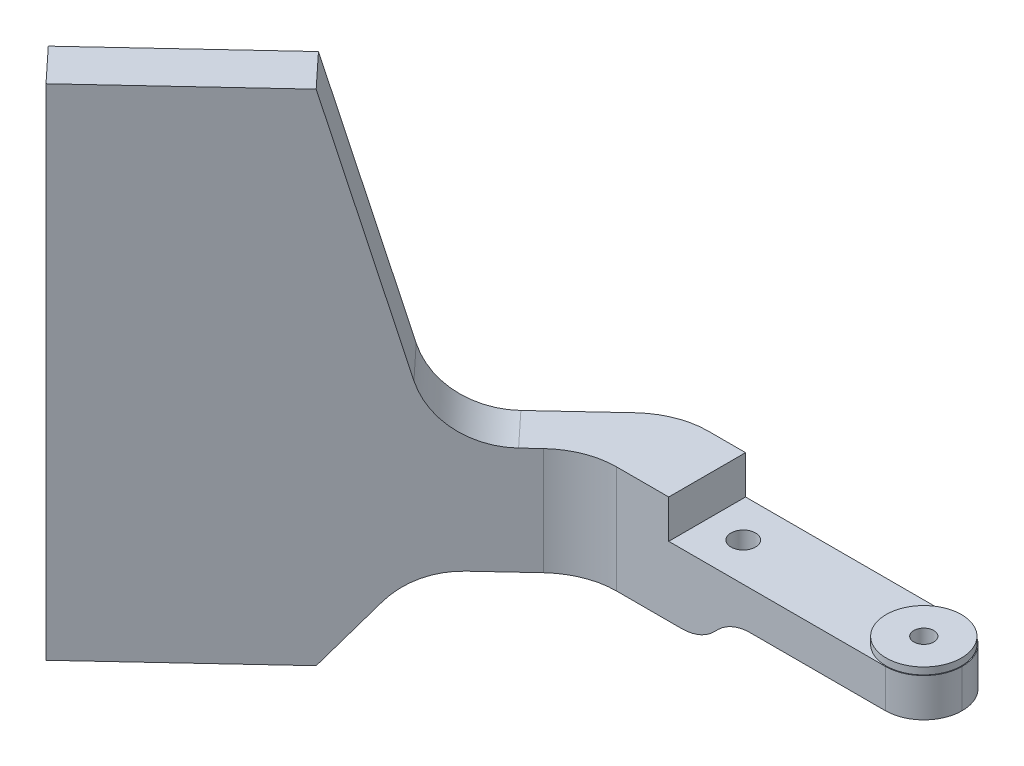
ISO-10303-21;
HEADER;
FILE_DESCRIPTION(('STEP AP214'),'2;1');
FILE_NAME('part.step','',(''),(''),'','','');
FILE_SCHEMA(('AUTOMOTIVE_DESIGN { 1 0 10303 214 1 1 1 1 }'));
ENDSEC;
DATA;
#1=APPLICATION_CONTEXT('core data for automotive mechanical design processes');
#2=APPLICATION_PROTOCOL_DEFINITION('international standard','automotive_design',2000,#1);
#3=PRODUCT_CONTEXT('',#1,'mechanical');
#4=PRODUCT('Part','Part','',(#3));
#5=PRODUCT_RELATED_PRODUCT_CATEGORY('part','',(#4));
#6=PRODUCT_DEFINITION_FORMATION('','',#4);
#7=PRODUCT_DEFINITION_CONTEXT('part definition',#1,'design');
#8=PRODUCT_DEFINITION('design','',#6,#7);
#9=PRODUCT_DEFINITION_SHAPE('','',#8);
#10=(LENGTH_UNIT() NAMED_UNIT(*) SI_UNIT(.MILLI.,.METRE.));
#11=(NAMED_UNIT(*) PLANE_ANGLE_UNIT() SI_UNIT($,.RADIAN.));
#12=(NAMED_UNIT(*) SI_UNIT($,.STERADIAN.) SOLID_ANGLE_UNIT());
#13=UNCERTAINTY_MEASURE_WITH_UNIT(LENGTH_MEASURE(1.E-05),#10,'distance_accuracy_value','');
#14=(GEOMETRIC_REPRESENTATION_CONTEXT(3) GLOBAL_UNCERTAINTY_ASSIGNED_CONTEXT((#13)) GLOBAL_UNIT_ASSIGNED_CONTEXT((#10,
#11,#12)) REPRESENTATION_CONTEXT('',''));
#15=CARTESIAN_POINT('',(0.,0.,0.));
#16=DIRECTION('',(0.,0.,1.));
#17=DIRECTION('',(1.,0.,0.));
#18=AXIS2_PLACEMENT_3D('',#15,#16,#17);
#19=CARTESIAN_POINT('',(0.,0.,0.));
#20=DIRECTION('',(0.,1.,0.));
#21=DIRECTION('',(0.,0.,1.));
#22=AXIS2_PLACEMENT_3D('',#19,#20,#21);
#23=PLANE('',#22);
#24=CARTESIAN_POINT('',(37.,0.,-4.99999999999999));
#25=DIRECTION('',(0.,1.,0.));
#26=DIRECTION('',(0.,0.,1.));
#27=AXIS2_PLACEMENT_3D('',#24,#25,#26);
#28=CIRCLE('',#27,1.29999999999999);
#29=CARTESIAN_POINT('',(37.,0.,-3.69999999999999));
#30=VERTEX_POINT('',#29);
#31=EDGE_CURVE('E344',#30,#30,#28,.T.);
#32=ORIENTED_EDGE('',*,*,#31,.T.);
#33=EDGE_LOOP('',(#32));
#34=FACE_BOUND('',#33,.T.);
#35=DIRECTION('',(-1.,0.,0.));
#36=VECTOR('',#35,1.);
#37=CARTESIAN_POINT('',(0.,0.,0.));
#38=LINE('',#37,#36);
#39=CARTESIAN_POINT('',(37.,0.,0.));
#40=VERTEX_POINT('',#39);
#41=CARTESIAN_POINT('',(19.4358017997251,0.,0.));
#42=VERTEX_POINT('',#41);
#43=EDGE_CURVE('E331',#40,#42,#38,.T.);
#44=ORIENTED_EDGE('',*,*,#43,.T.);
#45=DIRECTION('',(0.,0.,1.));
#46=VECTOR('',#45,1.);
#47=CARTESIAN_POINT('',(19.4358017997251,0.,0.));
#48=LINE('',#47,#46);
#49=CARTESIAN_POINT('',(19.4358017997251,0.,-10.));
#50=VERTEX_POINT('',#49);
#51=EDGE_CURVE('E209',#42,#50,#48,.F.);
#52=ORIENTED_EDGE('',*,*,#51,.T.);
#53=DIRECTION('',(1.,0.,0.));
#54=VECTOR('',#53,1.);
#55=CARTESIAN_POINT('',(0.,0.,-10.));
#56=LINE('',#55,#54);
#57=CARTESIAN_POINT('',(37.,0.,-10.));
#58=VERTEX_POINT('',#57);
#59=EDGE_CURVE('E338',#50,#58,#56,.T.);
#60=ORIENTED_EDGE('',*,*,#59,.T.);
#61=CARTESIAN_POINT('',(37.,0.,-5.));
#62=DIRECTION('',(0.,1.,0.));
#63=DIRECTION('',(0.,0.,1.));
#64=AXIS2_PLACEMENT_3D('',#61,#62,#63);
#65=CIRCLE('',#64,5.);
#66=CARTESIAN_POINT('',(42.,0.,-5.));
#67=VERTEX_POINT('',#66);
#68=EDGE_CURVE('E354',#58,#67,#65,.F.);
#69=ORIENTED_EDGE('',*,*,#68,.T.);
#70=CARTESIAN_POINT('',(37.,0.,-5.00000000000001));
#71=DIRECTION('',(0.,1.,0.));
#72=DIRECTION('',(0.,0.,1.));
#73=AXIS2_PLACEMENT_3D('',#70,#71,#72);
#74=CIRCLE('',#73,5.);
#75=EDGE_CURVE('E337',#67,#40,#74,.F.);
#76=ORIENTED_EDGE('',*,*,#75,.T.);
#77=EDGE_LOOP('',(#44,#52,#60,#69,#76));
#78=FACE_BOUND('',#77,.T.);
#79=ADVANCED_FACE('F34',(#34,#78),#23,.F.);
#80=CARTESIAN_POINT('',(0.,5.,0.));
#81=DIRECTION('',(0.,1.,0.));
#82=DIRECTION('',(0.,0.,1.));
#83=AXIS2_PLACEMENT_3D('',#80,#81,#82);
#84=PLANE('',#83);
#85=CARTESIAN_POINT('',(13.500000000001,5.,-5.00000000000016));
#86=DIRECTION('',(0.,1.,0.));
#87=DIRECTION('',(0.,0.,1.));
#88=AXIS2_PLACEMENT_3D('',#85,#86,#87);
#89=CIRCLE('',#88,1.6);
#90=CARTESIAN_POINT('',(13.500000000001,5.,-3.40000000000016));
#91=VERTEX_POINT('',#90);
#92=EDGE_CURVE('E202',#91,#91,#89,.T.);
#93=ORIENTED_EDGE('',*,*,#92,.F.);
#94=EDGE_LOOP('',(#93));
#95=FACE_BOUND('',#94,.T.);
#96=DIRECTION('',(0.,0.,-1.));
#97=VECTOR('',#96,1.);
#98=CARTESIAN_POINT('',(8.79767511383781,5.,-10.));
#99=LINE('',#98,#97);
#100=CARTESIAN_POINT('',(8.79767511383774,5.,0.));
#101=VERTEX_POINT('',#100);
#102=CARTESIAN_POINT('',(8.79767511383781,5.,-10.));
#103=VERTEX_POINT('',#102);
#104=EDGE_CURVE('E438',#101,#103,#99,.T.);
#105=ORIENTED_EDGE('',*,*,#104,.F.);
#106=DIRECTION('',(-1.,0.,0.));
#107=VECTOR('',#106,1.);
#108=CARTESIAN_POINT('',(0.,5.,0.));
#109=LINE('',#108,#107);
#110=CARTESIAN_POINT('',(37.,5.,0.));
#111=VERTEX_POINT('',#110);
#112=EDGE_CURVE('E341',#111,#101,#109,.T.);
#113=ORIENTED_EDGE('',*,*,#112,.F.);
#114=CARTESIAN_POINT('',(37.,5.,-5.00000000000001));
#115=DIRECTION('',(0.,1.,0.));
#116=DIRECTION('',(0.,0.,1.));
#117=AXIS2_PLACEMENT_3D('',#114,#115,#116);
#118=CIRCLE('',#117,5.);
#119=CARTESIAN_POINT('',(42.,5.,-5.));
#120=VERTEX_POINT('',#119);
#121=EDGE_CURVE('E362',#111,#120,#118,.T.);
#122=ORIENTED_EDGE('',*,*,#121,.T.);
#123=CARTESIAN_POINT('',(37.,5.,-5.));
#124=DIRECTION('',(0.,1.,0.));
#125=DIRECTION('',(0.,0.,1.));
#126=AXIS2_PLACEMENT_3D('',#123,#124,#125);
#127=CIRCLE('',#126,5.);
#128=CARTESIAN_POINT('',(37.,5.,-10.));
#129=VERTEX_POINT('',#128);
#130=EDGE_CURVE('E359',#120,#129,#127,.T.);
#131=ORIENTED_EDGE('',*,*,#130,.T.);
#132=DIRECTION('',(1.,0.,0.));
#133=VECTOR('',#132,1.);
#134=CARTESIAN_POINT('',(0.,5.,-10.));
#135=LINE('',#134,#133);
#136=EDGE_CURVE('E347',#103,#129,#135,.T.);
#137=ORIENTED_EDGE('',*,*,#136,.F.);
#138=EDGE_LOOP('',(#105,#113,#122,#131,#137));
#139=FACE_BOUND('',#138,.T.);
#140=CARTESIAN_POINT('',(37.,5.,-4.99999999999999));
#141=DIRECTION('',(0.,1.,0.));
#142=DIRECTION('',(0.,0.,1.));
#143=AXIS2_PLACEMENT_3D('',#140,#141,#142);
#144=CIRCLE('',#143,4.9);
#145=CARTESIAN_POINT('',(37.,5.,-0.0999999999999873));
#146=VERTEX_POINT('',#145);
#147=EDGE_CURVE('E366',#146,#146,#144,.T.);
#148=ORIENTED_EDGE('',*,*,#147,.F.);
#149=EDGE_LOOP('',(#148));
#150=FACE_BOUND('',#149,.T.);
#151=ADVANCED_FACE('F265',(#95,#139,#150),#84,.T.);
#152=CARTESIAN_POINT('',(-11.0535847060781,5.,8.51159926090981));
#153=DIRECTION('',(0.705053553573808,0.265760497297975,-0.657473075242537));
#154=DIRECTION('',(-0.681998360062495,0.,-0.731353701619174));
#155=AXIS2_PLACEMENT_3D('',#152,#153,#154);
#156=PLANE('',#155);
#157=DIRECTION('',(0.194364923443027,-0.964039085346612,-0.181248223326612));
#158=VECTOR('',#157,1.);
#159=CARTESIAN_POINT('',(-11.0535847060781,5.,8.51159926090981));
#160=LINE('',#159,#158);
#161=CARTESIAN_POINT('',(-20.1262682599731,50.,16.9720135466699));
#162=VERTEX_POINT('',#161);
#163=CARTESIAN_POINT('',(-13.5419990255742,17.3423950270202,10.8320831544008));
#164=VERTEX_POINT('',#163);
#165=EDGE_CURVE('E395',#162,#164,#160,.T.);
#166=ORIENTED_EDGE('',*,*,#165,.T.);
#167=DIRECTION('',(-0.681998360062495,0.,-0.731353701619174));
#168=VECTOR('',#167,1.);
#169=CARTESIAN_POINT('',(-13.5419990255742,17.3423950270202,10.8320831544008));
#170=LINE('',#169,#168);
#171=CARTESIAN_POINT('',(-17.6339891859491,17.3423950270202,6.44396094468579));
#172=VERTEX_POINT('',#171);
#173=EDGE_CURVE('E477',#164,#172,#170,.T.);
#174=ORIENTED_EDGE('',*,*,#173,.T.);
#175=DIRECTION('',(0.194364923443027,-0.964039085346612,-0.181248223326612));
#176=VECTOR('',#175,1.);
#177=CARTESIAN_POINT('',(-15.1455748664531,5.,4.12347705119476));
#178=LINE('',#177,#176);
#179=CARTESIAN_POINT('',(-24.2182584203481,50.,12.5838913369548));
#180=VERTEX_POINT('',#179);
#181=EDGE_CURVE('E394',#180,#172,#178,.T.);
#182=ORIENTED_EDGE('',*,*,#181,.F.);
#183=DIRECTION('',(-0.681998360062495,0.,-0.731353701619174));
#184=VECTOR('',#183,1.);
#185=CARTESIAN_POINT('',(-20.1262682599731,50.,16.9720135466699));
#186=LINE('',#185,#184);
#187=EDGE_CURVE('E370',#162,#180,#186,.T.);
#188=ORIENTED_EDGE('',*,*,#187,.F.);
#189=EDGE_LOOP('',(#166,#174,#182,#188));
#190=FACE_BOUND('',#189,.T.);
#191=ADVANCED_FACE('F261',(#190),#156,.T.);
#192=CARTESIAN_POINT('',(-11.0535847060781,0.,8.51159926090981));
#193=DIRECTION('',(0.563586903258906,-0.637309612531581,-0.525553289638531));
#194=DIRECTION('',(0.74910562425053,0.662450574545923,0.));
#195=AXIS2_PLACEMENT_3D('',#192,#193,#194);
#196=PLANE('',#195);
#197=DIRECTION('',(-0.466098744202454,-0.770607849541416,0.434644110598602));
#198=VECTOR('',#197,1.);
#199=CARTESIAN_POINT('',(-15.1455748664531,0.,4.12347705119476));
#200=LINE('',#199,#198);
#201=CARTESIAN_POINT('',(-19.7586738898521,-7.62690387468418,8.42526148436122));
#202=VERTEX_POINT('',#201);
#203=CARTESIAN_POINT('',(-24.2182584203481,-15.,12.5838913369548));
#204=VERTEX_POINT('',#203);
#205=EDGE_CURVE('E398',#202,#204,#200,.T.);
#206=ORIENTED_EDGE('',*,*,#205,.F.);
#207=DIRECTION('',(0.681998360062495,0.,0.731353701619174));
#208=VECTOR('',#207,1.);
#209=CARTESIAN_POINT('',(-15.6666837294771,-7.62690387468418,12.8133836940763));
#210=LINE('',#209,#208);
#211=CARTESIAN_POINT('',(-15.6666837294771,-7.62690387468418,12.8133836940763));
#212=VERTEX_POINT('',#211);
#213=EDGE_CURVE('E470',#202,#212,#210,.T.);
#214=ORIENTED_EDGE('',*,*,#213,.T.);
#215=DIRECTION('',(-0.466098744202454,-0.770607849541416,0.434644110598602));
#216=VECTOR('',#215,1.);
#217=CARTESIAN_POINT('',(-11.0535847060781,0.,8.51159926090981));
#218=LINE('',#217,#216);
#219=CARTESIAN_POINT('',(-20.1262682599731,-15.,16.9720135466699));
#220=VERTEX_POINT('',#219);
#221=EDGE_CURVE('E401',#212,#220,#218,.T.);
#222=ORIENTED_EDGE('',*,*,#221,.T.);
#223=DIRECTION('',(0.681998360062494,0.,0.731353701619174));
#224=VECTOR('',#223,1.);
#225=CARTESIAN_POINT('',(-20.1262682599731,-15.,16.9720135466699));
#226=LINE('',#225,#224);
#227=EDGE_CURVE('E407',#204,#220,#226,.T.);
#228=ORIENTED_EDGE('',*,*,#227,.F.);
#229=EDGE_LOOP('',(#206,#214,#222,#228));
#230=FACE_BOUND('',#229,.T.);
#231=ADVANCED_FACE('F264',(#230),#196,.T.);
#232=CARTESIAN_POINT('',(0.,5.,0.));
#233=DIRECTION('',(0.,0.,1.));
#234=DIRECTION('',(1.,0.,0.));
#235=AXIS2_PLACEMENT_3D('',#232,#233,#234);
#236=PLANE('',#235);
#237=DIRECTION('',(1.,0.,0.));
#238=VECTOR('',#237,1.);
#239=CARTESIAN_POINT('',(8.79767511383774,10.,0.));
#240=LINE('',#239,#238);
#241=CARTESIAN_POINT('',(2.01309276974024,10.,0.));
#242=VERTEX_POINT('',#241);
#243=CARTESIAN_POINT('',(8.79767511383774,10.,0.));
#244=VERTEX_POINT('',#243);
#245=EDGE_CURVE('E447',#242,#244,#240,.T.);
#246=ORIENTED_EDGE('',*,*,#245,.F.);
#247=DIRECTION('',(0.,-1.,0.));
#248=VECTOR('',#247,1.);
#249=CARTESIAN_POINT('',(2.01309276974024,5.,0.));
#250=LINE('',#249,#248);
#251=CARTESIAN_POINT('',(2.01309276974024,-4.,0.));
#252=VERTEX_POINT('',#251);
#253=EDGE_CURVE('E191',#242,#252,#250,.T.);
#254=ORIENTED_EDGE('',*,*,#253,.T.);
#255=DIRECTION('',(1.,0.,0.));
#256=VECTOR('',#255,1.);
#257=CARTESIAN_POINT('',(0.,-4.,0.));
#258=LINE('',#257,#256);
#259=CARTESIAN_POINT('',(10.465239051248,-4.,0.));
#260=VERTEX_POINT('',#259);
#261=EDGE_CURVE('E201',#252,#260,#258,.T.);
#262=ORIENTED_EDGE('',*,*,#261,.T.);
#263=CARTESIAN_POINT('',(10.465239051248,2.,0.));
#264=DIRECTION('',(0.,0.,1.));
#265=DIRECTION('',(1.,0.,0.));
#266=AXIS2_PLACEMENT_3D('',#263,#264,#265);
#267=CIRCLE('',#266,6.);
#268=CARTESIAN_POINT('',(14.7078797383672,-2.2426406871193,0.));
#269=VERTEX_POINT('',#268);
#270=EDGE_CURVE('E221',#260,#269,#267,.T.);
#271=ORIENTED_EDGE('',*,*,#270,.T.);
#272=DIRECTION('',(-0.707106781186551,-0.707106781186544,0.));
#273=VECTOR('',#272,1.);
#274=CARTESIAN_POINT('',(10.9752602127432,-5.97526021274331,0.));
#275=LINE('',#274,#273);
#276=CARTESIAN_POINT('',(15.1931611126059,-1.75735931288069,0.));
#277=VERTEX_POINT('',#276);
#278=EDGE_CURVE('E333',#269,#277,#275,.F.);
#279=ORIENTED_EDGE('',*,*,#278,.T.);
#280=CARTESIAN_POINT('',(19.4358017997251,-6.,0.));
#281=DIRECTION('',(0.,0.,1.));
#282=DIRECTION('',(1.,0.,0.));
#283=AXIS2_PLACEMENT_3D('',#280,#281,#282);
#284=CIRCLE('',#283,6.);
#285=EDGE_CURVE('E192',#277,#42,#284,.F.);
#286=ORIENTED_EDGE('',*,*,#285,.T.);
#287=ORIENTED_EDGE('',*,*,#43,.F.);
#288=DIRECTION('',(0.,-1.,0.));
#289=VECTOR('',#288,1.);
#290=CARTESIAN_POINT('',(37.,5.,0.));
#291=LINE('',#290,#289);
#292=EDGE_CURVE('E357',#40,#111,#291,.F.);
#293=ORIENTED_EDGE('',*,*,#292,.T.);
#294=ORIENTED_EDGE('',*,*,#112,.T.);
#295=DIRECTION('',(0.,-1.,0.));
#296=VECTOR('',#295,1.);
#297=CARTESIAN_POINT('',(8.79767511383774,10.,0.));
#298=LINE('',#297,#296);
#299=EDGE_CURVE('E377',#244,#101,#298,.T.);
#300=ORIENTED_EDGE('',*,*,#299,.F.);
#301=EDGE_LOOP('',(#246,#254,#262,#271,#279,#286,#287,#293,#294,#300));
#302=FACE_BOUND('',#301,.T.);
#303=ADVANCED_FACE('F269',(#302),#236,.T.);
#304=CARTESIAN_POINT('',(0.,5.,-10.));
#305=DIRECTION('',(0.,0.,-1.));
#306=DIRECTION('',(-1.,0.,0.));
#307=AXIS2_PLACEMENT_3D('',#304,#305,#306);
#308=PLANE('',#307);
#309=DIRECTION('',(1.,0.,0.));
#310=VECTOR('',#309,1.);
#311=CARTESIAN_POINT('',(8.79767511383777,-4.,-10.));
#312=LINE('',#311,#310);
#313=CARTESIAN_POINT('',(3.9391047561494,-4.,-10.));
#314=VERTEX_POINT('',#313);
#315=CARTESIAN_POINT('',(10.465239051248,-4.,-10.));
#316=VERTEX_POINT('',#315);
#317=EDGE_CURVE('E375',#314,#316,#312,.T.);
#318=ORIENTED_EDGE('',*,*,#317,.F.);
#319=DIRECTION('',(0.,-1.,0.));
#320=VECTOR('',#319,1.);
#321=CARTESIAN_POINT('',(3.9391047561494,10.,-10.));
#322=LINE('',#321,#320);
#323=CARTESIAN_POINT('',(3.9391047561494,10.,-10.));
#324=VERTEX_POINT('',#323);
#325=EDGE_CURVE('E49',#314,#324,#322,.F.);
#326=ORIENTED_EDGE('',*,*,#325,.T.);
#327=DIRECTION('',(-1.,0.,0.));
#328=VECTOR('',#327,1.);
#329=CARTESIAN_POINT('',(0.,10.,-10.));
#330=LINE('',#329,#328);
#331=CARTESIAN_POINT('',(8.79767511383781,10.,-10.));
#332=VERTEX_POINT('',#331);
#333=EDGE_CURVE('E439',#332,#324,#330,.T.);
#334=ORIENTED_EDGE('',*,*,#333,.F.);
#335=DIRECTION('',(0.,-1.,0.));
#336=VECTOR('',#335,1.);
#337=CARTESIAN_POINT('',(8.79767511383781,10.,-10.));
#338=LINE('',#337,#336);
#339=EDGE_CURVE('E383',#332,#103,#338,.T.);
#340=ORIENTED_EDGE('',*,*,#339,.T.);
#341=ORIENTED_EDGE('',*,*,#136,.T.);
#342=DIRECTION('',(0.,-1.,0.));
#343=VECTOR('',#342,1.);
#344=CARTESIAN_POINT('',(37.,0.,-10.));
#345=LINE('',#344,#343);
#346=EDGE_CURVE('E364',#129,#58,#345,.T.);
#347=ORIENTED_EDGE('',*,*,#346,.T.);
#348=ORIENTED_EDGE('',*,*,#59,.F.);
#349=CARTESIAN_POINT('',(19.4358017997251,-6.,-10.));
#350=DIRECTION('',(0.,0.,-1.));
#351=DIRECTION('',(-1.,0.,0.));
#352=AXIS2_PLACEMENT_3D('',#349,#350,#351);
#353=CIRCLE('',#352,6.);
#354=CARTESIAN_POINT('',(15.1931611126059,-1.75735931288069,-10.));
#355=VERTEX_POINT('',#354);
#356=EDGE_CURVE('E224',#50,#355,#353,.F.);
#357=ORIENTED_EDGE('',*,*,#356,.T.);
#358=DIRECTION('',(0.707106781186551,0.707106781186544,0.));
#359=VECTOR('',#358,1.);
#360=CARTESIAN_POINT('',(10.9752602127432,-5.97526021274331,-10.));
#361=LINE('',#360,#359);
#362=CARTESIAN_POINT('',(14.7078797383672,-2.2426406871193,-10.));
#363=VERTEX_POINT('',#362);
#364=EDGE_CURVE('E213',#355,#363,#361,.F.);
#365=ORIENTED_EDGE('',*,*,#364,.T.);
#366=CARTESIAN_POINT('',(10.465239051248,2.,-10.));
#367=DIRECTION('',(0.,0.,-1.));
#368=DIRECTION('',(-1.,0.,0.));
#369=AXIS2_PLACEMENT_3D('',#366,#367,#368);
#370=CIRCLE('',#369,6.);
#371=EDGE_CURVE('E208',#363,#316,#370,.T.);
#372=ORIENTED_EDGE('',*,*,#371,.T.);
#373=EDGE_LOOP('',(#318,#326,#334,#340,#341,#347,#348,#357,#365,#372));
#374=FACE_BOUND('',#373,.T.);
#375=ADVANCED_FACE('F301',(#374),#308,.T.);
#376=CARTESIAN_POINT('',(-4.98782025129912,5.,-5.34878236872068));
#377=DIRECTION('',(0.681998360062495,0.,0.731353701619174));
#378=DIRECTION('',(0.731353701619174,0.,-0.681998360062495));
#379=AXIS2_PLACEMENT_3D('',#376,#377,#378);
#380=PLANE('',#379);
#381=DIRECTION('',(-0.731353701619174,0.,0.681998360062495));
#382=VECTOR('',#381,1.);
#383=CARTESIAN_POINT('',(-20.8916077839199,10.,9.48173943217613));
#384=LINE('',#383,#382);
#385=CARTESIAN_POINT('',(-2.88087884447556,10.,-7.31353701619174));
#386=VERTEX_POINT('',#385);
#387=CARTESIAN_POINT('',(-10.5834536502111,10.,-0.130769807739583));
#388=VERTEX_POINT('',#387);
#389=EDGE_CURVE('E441',#386,#388,#384,.T.);
#390=ORIENTED_EDGE('',*,*,#389,.F.);
#391=DIRECTION('',(0.,-1.,0.));
#392=VECTOR('',#391,1.);
#393=CARTESIAN_POINT('',(-2.88087884447555,-4.,-7.31353701619174));
#394=LINE('',#393,#392);
#395=CARTESIAN_POINT('',(-2.88087884447555,-4.,-7.31353701619174));
#396=VERTEX_POINT('',#395);
#397=EDGE_CURVE('E498',#386,#396,#394,.T.);
#398=ORIENTED_EDGE('',*,*,#397,.T.);
#399=DIRECTION('',(0.731353701619174,0.,-0.681998360062495));
#400=VECTOR('',#399,1.);
#401=CARTESIAN_POINT('',(0.,-4.,-10.));
#402=LINE('',#401,#400);
#403=CARTESIAN_POINT('',(-14.122804857263,-4.,3.1697285879759));
#404=VERTEX_POINT('',#403);
#405=EDGE_CURVE('E380',#404,#396,#402,.T.);
#406=ORIENTED_EDGE('',*,*,#405,.F.);
#407=CARTESIAN_POINT('',(-14.122804857263,-14.,3.1697285879759));
#408=DIRECTION('',(0.681998360062495,0.,0.731353701619174));
#409=DIRECTION('',(0.731353701619174,0.,-0.681998360062495));
#410=AXIS2_PLACEMENT_3D('',#407,#408,#409);
#411=CIRCLE('',#410,10.);
#412=EDGE_CURVE('E485',#404,#202,#411,.T.);
#413=ORIENTED_EDGE('',*,*,#412,.T.);
#414=ORIENTED_EDGE('',*,*,#205,.T.);
#415=DIRECTION('',(0.731353701619174,0.,-0.681998360062495));
#416=VECTOR('',#415,1.);
#417=CARTESIAN_POINT('',(-24.2182584203481,-15.,12.5838913369548));
#418=LINE('',#417,#416);
#419=CARTESIAN_POINT('',(-42.4185146939121,-15.,29.5559048836247));
#420=VERTEX_POINT('',#419);
#421=EDGE_CURVE('E403',#420,#204,#418,.T.);
#422=ORIENTED_EDGE('',*,*,#421,.F.);
#423=DIRECTION('',(0.,-1.,0.));
#424=VECTOR('',#423,1.);
#425=CARTESIAN_POINT('',(-42.4185146939121,5.,29.5559048836247));
#426=LINE('',#425,#424);
#427=CARTESIAN_POINT('',(-42.4185146939121,50.,29.5559048836247));
#428=VERTEX_POINT('',#427);
#429=EDGE_CURVE('E352',#428,#420,#426,.T.);
#430=ORIENTED_EDGE('',*,*,#429,.F.);
#431=DIRECTION('',(-0.731353701619174,0.,0.681998360062495));
#432=VECTOR('',#431,1.);
#433=CARTESIAN_POINT('',(-24.2182584203481,50.,12.5838913369548));
#434=LINE('',#433,#432);
#435=EDGE_CURVE('E416',#180,#428,#434,.T.);
#436=ORIENTED_EDGE('',*,*,#435,.F.);
#437=ORIENTED_EDGE('',*,*,#181,.T.);
#438=CARTESIAN_POINT('',(-10.5834536502111,20.,-0.130769807739583));
#439=DIRECTION('',(0.681998360062495,0.,0.731353701619174));
#440=DIRECTION('',(0.731353701619174,0.,-0.681998360062495));
#441=AXIS2_PLACEMENT_3D('',#438,#439,#440);
#442=CIRCLE('',#441,10.);
#443=EDGE_CURVE('E42',#172,#388,#442,.T.);
#444=ORIENTED_EDGE('',*,*,#443,.T.);
#445=EDGE_LOOP('',(#390,#398,#406,#413,#414,#422,#430,#436,#437,#444));
#446=FACE_BOUND('',#445,.T.);
#447=ADVANCED_FACE('F297',(#446),#380,.F.);
#448=CARTESIAN_POINT('',(-37.430694442613,5.,34.9046872523454));
#449=DIRECTION('',(0.731353701619174,0.,-0.681998360062495));
#450=DIRECTION('',(-0.681998360062495,0.,-0.731353701619174));
#451=AXIS2_PLACEMENT_3D('',#448,#449,#450);
#452=PLANE('',#451);
#453=ORIENTED_EDGE('',*,*,#429,.T.);
#454=DIRECTION('',(-0.681998360062496,0.,-0.731353701619173));
#455=VECTOR('',#454,1.);
#456=CARTESIAN_POINT('',(-42.4185146939121,-15.,29.5559048836247));
#457=LINE('',#456,#455);
#458=CARTESIAN_POINT('',(-38.3265245335371,-15.,33.9440270933397));
#459=VERTEX_POINT('',#458);
#460=EDGE_CURVE('E413',#459,#420,#457,.T.);
#461=ORIENTED_EDGE('',*,*,#460,.F.);
#462=DIRECTION('',(0.,-1.,0.));
#463=VECTOR('',#462,1.);
#464=CARTESIAN_POINT('',(-38.3265245335371,5.,33.9440270933397));
#465=LINE('',#464,#463);
#466=CARTESIAN_POINT('',(-38.3265245335371,50.,33.9440270933397));
#467=VERTEX_POINT('',#466);
#468=EDGE_CURVE('E350',#467,#459,#465,.T.);
#469=ORIENTED_EDGE('',*,*,#468,.F.);
#470=DIRECTION('',(0.681998360062496,0.,0.731353701619173));
#471=VECTOR('',#470,1.);
#472=CARTESIAN_POINT('',(-42.4185146939121,50.,29.5559048836247));
#473=LINE('',#472,#471);
#474=EDGE_CURVE('E419',#428,#467,#473,.T.);
#475=ORIENTED_EDGE('',*,*,#474,.F.);
#476=EDGE_LOOP('',(#453,#461,#469,#475));
#477=FACE_BOUND('',#476,.T.);
#478=ADVANCED_FACE('F293',(#477),#452,.F.);
#479=CARTESIAN_POINT('',(-0.895830090924156,5.,-0.960660159005641));
#480=DIRECTION('',(-0.681998360062495,0.,-0.731353701619174));
#481=DIRECTION('',(-0.731353701619174,0.,0.681998360062495));
#482=AXIS2_PLACEMENT_3D('',#479,#480,#481);
#483=PLANE('',#482);
#484=DIRECTION('',(-0.731353701619174,0.,0.681998360062495));
#485=VECTOR('',#484,1.);
#486=CARTESIAN_POINT('',(-15.5899264830256,-4.,12.7418064037898));
#487=LINE('',#486,#485);
#488=CARTESIAN_POINT('',(-4.8068908308847,-4.,2.68646298380826));
#489=VERTEX_POINT('',#488);
#490=CARTESIAN_POINT('',(-10.0308146968881,-4.,7.55785079769095));
#491=VERTEX_POINT('',#490);
#492=EDGE_CURVE('E376',#489,#491,#487,.T.);
#493=ORIENTED_EDGE('',*,*,#492,.F.);
#494=DIRECTION('',(0.,-1.,0.));
#495=VECTOR('',#494,1.);
#496=CARTESIAN_POINT('',(-4.8068908308847,5.,2.68646298380826));
#497=LINE('',#496,#495);
#498=CARTESIAN_POINT('',(-4.8068908308847,10.,2.68646298380826));
#499=VERTEX_POINT('',#498);
#500=EDGE_CURVE('E493',#489,#499,#497,.F.);
#501=ORIENTED_EDGE('',*,*,#500,.T.);
#502=DIRECTION('',(0.731353701619174,0.,-0.681998360062495));
#503=VECTOR('',#502,1.);
#504=CARTESIAN_POINT('',(-1.92601198640915,10.,0.));
#505=LINE('',#504,#503);
#506=CARTESIAN_POINT('',(-6.4914634898361,10.,4.25735240197545));
#507=VERTEX_POINT('',#506);
#508=EDGE_CURVE('E449',#507,#499,#505,.T.);
#509=ORIENTED_EDGE('',*,*,#508,.F.);
#510=CARTESIAN_POINT('',(-6.4914634898361,20.,4.25735240197545));
#511=DIRECTION('',(-0.681998360062495,0.,-0.731353701619174));
#512=DIRECTION('',(-0.731353701619174,0.,0.681998360062495));
#513=AXIS2_PLACEMENT_3D('',#510,#511,#512);
#514=CIRCLE('',#513,10.);
#515=EDGE_CURVE('E11',#507,#164,#514,.T.);
#516=ORIENTED_EDGE('',*,*,#515,.T.);
#517=ORIENTED_EDGE('',*,*,#165,.F.);
#518=DIRECTION('',(0.731353701619174,0.,-0.681998360062495));
#519=VECTOR('',#518,1.);
#520=CARTESIAN_POINT('',(-38.3265245335371,50.,33.9440270933397));
#521=LINE('',#520,#519);
#522=EDGE_CURVE('E422',#467,#162,#521,.T.);
#523=ORIENTED_EDGE('',*,*,#522,.F.);
#524=ORIENTED_EDGE('',*,*,#468,.T.);
#525=DIRECTION('',(-0.731353701619174,0.,0.681998360062494));
#526=VECTOR('',#525,1.);
#527=CARTESIAN_POINT('',(-38.3265245335371,-15.,33.9440270933397));
#528=LINE('',#527,#526);
#529=EDGE_CURVE('E410',#220,#459,#528,.T.);
#530=ORIENTED_EDGE('',*,*,#529,.F.);
#531=ORIENTED_EDGE('',*,*,#221,.F.);
#532=CARTESIAN_POINT('',(-10.0308146968881,-14.,7.55785079769094));
#533=DIRECTION('',(-0.681998360062495,0.,-0.731353701619174));
#534=DIRECTION('',(-0.731353701619174,0.,0.681998360062495));
#535=AXIS2_PLACEMENT_3D('',#532,#533,#534);
#536=CIRCLE('',#535,10.);
#537=EDGE_CURVE('E483',#212,#491,#536,.T.);
#538=ORIENTED_EDGE('',*,*,#537,.T.);
#539=EDGE_LOOP('',(#493,#501,#509,#516,#517,#523,#524,#530,#531,#538));
#540=FACE_BOUND('',#539,.T.);
#541=ADVANCED_FACE('F289',(#540),#483,.F.);
#542=CARTESIAN_POINT('',(37.,5.,-5.));
#543=DIRECTION('',(0.,1.,0.));
#544=DIRECTION('',(0.,0.,1.));
#545=AXIS2_PLACEMENT_3D('',#542,#543,#544);
#546=CYLINDRICAL_SURFACE('',#545,5.);
#547=ORIENTED_EDGE('',*,*,#346,.F.);
#548=ORIENTED_EDGE('',*,*,#130,.F.);
#549=DIRECTION('',(0.,-1.,0.));
#550=VECTOR('',#549,1.);
#551=CARTESIAN_POINT('',(42.,5.,-5.));
#552=LINE('',#551,#550);
#553=EDGE_CURVE('E339',#67,#120,#552,.F.);
#554=ORIENTED_EDGE('',*,*,#553,.F.);
#555=ORIENTED_EDGE('',*,*,#68,.F.);
#556=EDGE_LOOP('',(#547,#548,#554,#555));
#557=FACE_BOUND('',#556,.T.);
#558=ADVANCED_FACE('F292',(#557),#546,.T.);
#559=CARTESIAN_POINT('',(37.,5.,-5.00000000000001));
#560=DIRECTION('',(0.,1.,0.));
#561=DIRECTION('',(0.,0.,1.));
#562=AXIS2_PLACEMENT_3D('',#559,#560,#561);
#563=CYLINDRICAL_SURFACE('',#562,5.);
#564=ORIENTED_EDGE('',*,*,#121,.F.);
#565=ORIENTED_EDGE('',*,*,#292,.F.);
#566=ORIENTED_EDGE('',*,*,#75,.F.);
#567=ORIENTED_EDGE('',*,*,#553,.T.);
#568=EDGE_LOOP('',(#564,#565,#566,#567));
#569=FACE_BOUND('',#568,.T.);
#570=ADVANCED_FACE('F281',(#569),#563,.T.);
#571=CARTESIAN_POINT('',(37.,-5.,-4.99999999999999));
#572=DIRECTION('',(0.,1.,0.));
#573=DIRECTION('',(0.,0.,1.));
#574=AXIS2_PLACEMENT_3D('',#571,#572,#573);
#575=CYLINDRICAL_SURFACE('',#574,1.29999999999999);
#576=ORIENTED_EDGE('',*,*,#31,.F.);
#577=EDGE_LOOP('',(#576));
#578=FACE_BOUND('',#577,.T.);
#579=CARTESIAN_POINT('',(37.,5.9,-4.99999999999999));
#580=DIRECTION('',(0.,-1.,0.));
#581=DIRECTION('',(0.,0.,-1.));
#582=AXIS2_PLACEMENT_3D('',#579,#580,#581);
#583=CIRCLE('',#582,1.29999999999999);
#584=CARTESIAN_POINT('',(37.,5.9,-6.29999999999998));
#585=VERTEX_POINT('',#584);
#586=EDGE_CURVE('E388',#585,#585,#583,.T.);
#587=ORIENTED_EDGE('',*,*,#586,.F.);
#588=EDGE_LOOP('',(#587));
#589=FACE_BOUND('',#588,.T.);
#590=ADVANCED_FACE('F277',(#578,#589),#575,.F.);
#591=CARTESIAN_POINT('',(0.,50.,0.));
#592=DIRECTION('',(0.,1.,0.));
#593=DIRECTION('',(0.,0.,1.));
#594=AXIS2_PLACEMENT_3D('',#591,#592,#593);
#595=PLANE('',#594);
#596=ORIENTED_EDGE('',*,*,#435,.T.);
#597=ORIENTED_EDGE('',*,*,#474,.T.);
#598=ORIENTED_EDGE('',*,*,#522,.T.);
#599=ORIENTED_EDGE('',*,*,#187,.T.);
#600=EDGE_LOOP('',(#596,#597,#598,#599));
#601=FACE_BOUND('',#600,.T.);
#602=ADVANCED_FACE('F273',(#601),#595,.T.);
#603=CARTESIAN_POINT('',(0.,-15.,0.));
#604=DIRECTION('',(0.,1.,0.));
#605=DIRECTION('',(0.,0.,1.));
#606=AXIS2_PLACEMENT_3D('',#603,#604,#605);
#607=PLANE('',#606);
#608=ORIENTED_EDGE('',*,*,#421,.T.);
#609=ORIENTED_EDGE('',*,*,#227,.T.);
#610=ORIENTED_EDGE('',*,*,#529,.T.);
#611=ORIENTED_EDGE('',*,*,#460,.T.);
#612=EDGE_LOOP('',(#608,#609,#610,#611));
#613=FACE_BOUND('',#612,.T.);
#614=ADVANCED_FACE('F259',(#613),#607,.F.);
#615=CARTESIAN_POINT('',(37.,5.9,-4.99999999999999));
#616=DIRECTION('',(0.,-1.,0.));
#617=DIRECTION('',(0.,0.,-1.));
#618=AXIS2_PLACEMENT_3D('',#615,#616,#617);
#619=CYLINDRICAL_SURFACE('',#618,4.9);
#620=ORIENTED_EDGE('',*,*,#147,.T.);
#621=EDGE_LOOP('',(#620));
#622=FACE_BOUND('',#621,.T.);
#623=CARTESIAN_POINT('',(37.,5.9,-4.99999999999999));
#624=DIRECTION('',(0.,-1.,0.));
#625=DIRECTION('',(0.,0.,-1.));
#626=AXIS2_PLACEMENT_3D('',#623,#624,#625);
#627=CIRCLE('',#626,4.9);
#628=CARTESIAN_POINT('',(37.,5.9,-9.89999999999999));
#629=VERTEX_POINT('',#628);
#630=EDGE_CURVE('E391',#629,#629,#627,.T.);
#631=ORIENTED_EDGE('',*,*,#630,.T.);
#632=EDGE_LOOP('',(#631));
#633=FACE_BOUND('',#632,.T.);
#634=ADVANCED_FACE('F255',(#622,#633),#619,.T.);
#635=CARTESIAN_POINT('',(37.,5.9,-4.99999999999999));
#636=DIRECTION('',(0.,-1.,0.));
#637=DIRECTION('',(0.,0.,-1.));
#638=AXIS2_PLACEMENT_3D('',#635,#636,#637);
#639=PLANE('',#638);
#640=ORIENTED_EDGE('',*,*,#586,.T.);
#641=EDGE_LOOP('',(#640));
#642=FACE_BOUND('',#641,.T.);
#643=ORIENTED_EDGE('',*,*,#630,.F.);
#644=EDGE_LOOP('',(#643));
#645=FACE_BOUND('',#644,.T.);
#646=ADVANCED_FACE('F252',(#642,#645),#639,.F.);
#647=CARTESIAN_POINT('',(0.,-4.,0.));
#648=DIRECTION('',(0.,1.,0.));
#649=DIRECTION('',(0.,0.,1.));
#650=AXIS2_PLACEMENT_3D('',#647,#648,#649);
#651=PLANE('',#650);
#652=ORIENTED_EDGE('',*,*,#405,.T.);
#653=CARTESIAN_POINT('',(3.9391047561494,-4.,0.));
#654=DIRECTION('',(0.,1.,0.));
#655=DIRECTION('',(0.,0.,1.));
#656=AXIS2_PLACEMENT_3D('',#653,#654,#655);
#657=CIRCLE('',#656,10.);
#658=EDGE_CURVE('E57',#396,#314,#657,.F.);
#659=ORIENTED_EDGE('',*,*,#658,.T.);
#660=ORIENTED_EDGE('',*,*,#317,.T.);
#661=DIRECTION('',(0.,0.,-1.));
#662=VECTOR('',#661,1.);
#663=CARTESIAN_POINT('',(10.465239051248,-4.,0.));
#664=LINE('',#663,#662);
#665=EDGE_CURVE('E218',#316,#260,#664,.F.);
#666=ORIENTED_EDGE('',*,*,#665,.T.);
#667=ORIENTED_EDGE('',*,*,#261,.F.);
#668=CARTESIAN_POINT('',(2.01309276974024,-4.,10.));
#669=DIRECTION('',(0.,1.,0.));
#670=DIRECTION('',(0.,0.,1.));
#671=AXIS2_PLACEMENT_3D('',#668,#669,#670);
#672=CIRCLE('',#671,10.);
#673=EDGE_CURVE('E479',#252,#489,#672,.T.);
#674=ORIENTED_EDGE('',*,*,#673,.T.);
#675=ORIENTED_EDGE('',*,*,#492,.T.);
#676=DIRECTION('',(0.681998360062495,0.,0.731353701619174));
#677=VECTOR('',#676,1.);
#678=CARTESIAN_POINT('',(-9.13498460596393,-4.,8.51851095669658));
#679=LINE('',#678,#677);
#680=EDGE_CURVE('E499',#491,#404,#679,.F.);
#681=ORIENTED_EDGE('',*,*,#680,.T.);
#682=EDGE_LOOP('',(#652,#659,#660,#666,#667,#674,#675,#681));
#683=FACE_BOUND('',#682,.T.);
#684=ADVANCED_FACE('F248',(#683),#651,.F.);
#685=CARTESIAN_POINT('',(8.79767511383781,10.,-10.));
#686=DIRECTION('',(-1.,0.,0.));
#687=DIRECTION('',(0.,0.,1.));
#688=AXIS2_PLACEMENT_3D('',#685,#686,#687);
#689=PLANE('',#688);
#690=ORIENTED_EDGE('',*,*,#104,.T.);
#691=ORIENTED_EDGE('',*,*,#339,.F.);
#692=DIRECTION('',(0.,0.,-1.));
#693=VECTOR('',#692,1.);
#694=CARTESIAN_POINT('',(8.79767511383781,10.,-10.));
#695=LINE('',#694,#693);
#696=EDGE_CURVE('E445',#244,#332,#695,.T.);
#697=ORIENTED_EDGE('',*,*,#696,.F.);
#698=ORIENTED_EDGE('',*,*,#299,.T.);
#699=EDGE_LOOP('',(#690,#691,#697,#698));
#700=FACE_BOUND('',#699,.T.);
#701=ADVANCED_FACE('F244',(#700),#689,.F.);
#702=CARTESIAN_POINT('',(0.,10.,0.));
#703=DIRECTION('',(0.,-1.,0.));
#704=DIRECTION('',(0.,0.,-1.));
#705=AXIS2_PLACEMENT_3D('',#702,#703,#704);
#706=PLANE('',#705);
#707=ORIENTED_EDGE('',*,*,#333,.T.);
#708=CARTESIAN_POINT('',(3.9391047561494,10.,0.));
#709=DIRECTION('',(0.,-1.,0.));
#710=DIRECTION('',(0.,0.,-1.));
#711=AXIS2_PLACEMENT_3D('',#708,#709,#710);
#712=CIRCLE('',#711,10.);
#713=EDGE_CURVE('E462',#324,#386,#712,.F.);
#714=ORIENTED_EDGE('',*,*,#713,.T.);
#715=ORIENTED_EDGE('',*,*,#389,.T.);
#716=DIRECTION('',(-0.681998360062495,0.,-0.731353701619174));
#717=VECTOR('',#716,1.);
#718=CARTESIAN_POINT('',(-5.59563339891194,10.,5.2180125609811));
#719=LINE('',#718,#717);
#720=EDGE_CURVE('E459',#388,#507,#719,.F.);
#721=ORIENTED_EDGE('',*,*,#720,.T.);
#722=ORIENTED_EDGE('',*,*,#508,.T.);
#723=CARTESIAN_POINT('',(2.01309276974024,10.,10.));
#724=DIRECTION('',(0.,-1.,0.));
#725=DIRECTION('',(0.,0.,-1.));
#726=AXIS2_PLACEMENT_3D('',#723,#724,#725);
#727=CIRCLE('',#726,10.);
#728=EDGE_CURVE('E481',#499,#242,#727,.T.);
#729=ORIENTED_EDGE('',*,*,#728,.T.);
#730=ORIENTED_EDGE('',*,*,#245,.T.);
#731=ORIENTED_EDGE('',*,*,#696,.T.);
#732=EDGE_LOOP('',(#707,#714,#715,#721,#722,#729,#730,#731));
#733=FACE_BOUND('',#732,.T.);
#734=ADVANCED_FACE('F241',(#733),#706,.F.);
#735=CARTESIAN_POINT('',(12.9505204254865,-4.,0.));
#736=DIRECTION('',(-0.707106781186544,0.707106781186551,0.));
#737=DIRECTION('',(0.,0.,1.));
#738=AXIS2_PLACEMENT_3D('',#735,#736,#737);
#739=PLANE('',#738);
#740=CARTESIAN_POINT('',(13.500000000001,-3.45052042548553,-5.00000000000016));
#741=DIRECTION('',(-0.707106781186544,0.707106781186551,0.));
#742=DIRECTION('',(0.707106781186551,0.707106781186544,0.));
#743=AXIS2_PLACEMENT_3D('',#740,#741,#742);
#744=ELLIPSE('',#743,2.26274169979694,1.6);
#745=CARTESIAN_POINT('',(14.7078797383672,-2.24264068711931,-6.04929811666878));
#746=VERTEX_POINT('',#745);
#747=CARTESIAN_POINT('',(14.7078797383672,-2.2426406871193,-3.95070188333153));
#748=VERTEX_POINT('',#747);
#749=EDGE_CURVE('E186',#746,#748,#744,.F.);
#750=ORIENTED_EDGE('',*,*,#749,.F.);
#751=DIRECTION('',(0.,0.,1.));
#752=VECTOR('',#751,1.);
#753=CARTESIAN_POINT('',(14.7078797383672,-2.2426406871193,-10.));
#754=LINE('',#753,#752);
#755=EDGE_CURVE('E197',#746,#363,#754,.F.);
#756=ORIENTED_EDGE('',*,*,#755,.T.);
#757=ORIENTED_EDGE('',*,*,#364,.F.);
#758=DIRECTION('',(0.,0.,-1.));
#759=VECTOR('',#758,1.);
#760=CARTESIAN_POINT('',(15.1931611126059,-1.75735931288069,0.));
#761=LINE('',#760,#759);
#762=EDGE_CURVE('E211',#355,#277,#761,.F.);
#763=ORIENTED_EDGE('',*,*,#762,.T.);
#764=ORIENTED_EDGE('',*,*,#278,.F.);
#765=EDGE_CURVE('E200',#269,#748,#754,.F.);
#766=ORIENTED_EDGE('',*,*,#765,.T.);
#767=EDGE_LOOP('',(#750,#756,#757,#763,#764,#766));
#768=FACE_BOUND('',#767,.T.);
#769=ADVANCED_FACE('F195',(#768),#739,.F.);
#770=CARTESIAN_POINT('',(19.4358017997251,-6.,0.));
#771=DIRECTION('',(0.,0.,1.));
#772=DIRECTION('',(1.,0.,0.));
#773=AXIS2_PLACEMENT_3D('',#770,#771,#772);
#774=CYLINDRICAL_SURFACE('',#773,6.);
#775=ORIENTED_EDGE('',*,*,#285,.F.);
#776=ORIENTED_EDGE('',*,*,#762,.F.);
#777=ORIENTED_EDGE('',*,*,#356,.F.);
#778=ORIENTED_EDGE('',*,*,#51,.F.);
#779=EDGE_LOOP('',(#775,#776,#777,#778));
#780=FACE_BOUND('',#779,.T.);
#781=ADVANCED_FACE('F315',(#780),#774,.F.);
#782=CARTESIAN_POINT('',(10.465239051248,2.,0.));
#783=DIRECTION('',(0.,0.,1.));
#784=DIRECTION('',(1.,0.,0.));
#785=AXIS2_PLACEMENT_3D('',#782,#783,#784);
#786=CYLINDRICAL_SURFACE('',#785,6.);
#787=CARTESIAN_POINT('',(14.7078797383672,-2.24264068711931,-3.95070188333153));
#788=CARTESIAN_POINT('',(14.6706243750281,-2.27990864527394,-3.90784896111515));
#789=CARTESIAN_POINT('',(14.6315116818341,-2.31802775677892,-3.86740191972816));
#790=CARTESIAN_POINT('',(14.5498574310938,-2.39534114121528,-3.79131023336492));
#791=CARTESIAN_POINT('',(14.5073169504571,-2.43453507393656,-3.7556640894181));
#792=CARTESIAN_POINT('',(14.418861269681,-2.51358091595233,-3.68898124322543));
#793=CARTESIAN_POINT('',(14.3729311071,-2.55343505592476,-3.65796706091106));
#794=CARTESIAN_POINT('',(14.2781112806919,-2.63312507941058,-3.60085453620755));
#795=CARTESIAN_POINT('',(14.2292213381939,-2.67296096084799,-3.57475665765513));
#796=CARTESIAN_POINT('',(14.0809939038977,-2.78976104663452,-3.50529317788726));
#797=CARTESIAN_POINT('',(13.977744786793,-2.86614490143569,-3.46899302629745));
#798=CARTESIAN_POINT('',(13.7630653398004,-3.01410701556082,-3.41793766557364));
#799=CARTESIAN_POINT('',(13.6516544040045,-3.08569593969285,-3.40313301826042));
#800=CARTESIAN_POINT('',(13.4479569946985,-3.20714455011659,-3.39832668887941));
#801=CARTESIAN_POINT('',(13.3566112341837,-3.25839706372232,-3.40374018383305));
#802=CARTESIAN_POINT('',(13.1732574745302,-3.3551237876948,-3.43098311715451));
#803=CARTESIAN_POINT('',(13.0812497915339,-3.40060058512844,-3.45280517524664));
#804=CARTESIAN_POINT('',(12.8992826813897,-3.48502990781994,-3.51393153021824));
#805=CARTESIAN_POINT('',(12.8093386629356,-3.5239420840053,-3.55333887801294));
#806=CARTESIAN_POINT('',(12.6360965446582,-3.59429349256595,-3.64963979172707));
#807=CARTESIAN_POINT('',(12.552795496504,-3.62573605256123,-3.70652554523673));
#808=CARTESIAN_POINT('',(12.4054590000961,-3.6781168274618,-3.8294548906998));
#809=CARTESIAN_POINT('',(12.3403145773027,-3.69982251328348,-3.89384737707128));
#810=CARTESIAN_POINT('',(12.2213766423177,-3.73758503014973,-4.03379881672852));
#811=CARTESIAN_POINT('',(12.1675791191798,-3.75364385861118,-4.10935380813522));
#812=CARTESIAN_POINT('',(12.0762597669683,-3.77985720417695,-4.26473014335878));
#813=CARTESIAN_POINT('',(12.0379846638582,-3.79029623151781,-4.34406238532357));
#814=CARTESIAN_POINT('',(11.9748835817751,-3.80706859918339,-4.50831229143508));
#815=CARTESIAN_POINT('',(11.9500563730237,-3.81340231493968,-4.59322944405805));
#816=CARTESIAN_POINT('',(11.9149204474092,-3.8222634265202,-4.76518608612664));
#817=CARTESIAN_POINT('',(11.9044487725592,-3.82483356808571,-4.85219014891348));
#818=CARTESIAN_POINT('',(11.8978410400658,-3.82646239033491,-5.02677449447024));
#819=CARTESIAN_POINT('',(11.9017049125374,-3.82552108813666,-5.11435477442905));
#820=CARTESIAN_POINT('',(11.9236396703731,-3.82006812242334,-5.28759420597453));
#821=CARTESIAN_POINT('',(11.9417089557368,-3.81555686100359,-5.37325357280218));
#822=CARTESIAN_POINT('',(11.9914430527619,-3.80270245034705,-5.5402251609841));
#823=CARTESIAN_POINT('',(12.023107415842,-3.7943594275419,-5.62153752567193));
#824=CARTESIAN_POINT('',(12.0989247719095,-3.77343995371212,-5.77749831106182));
#825=CARTESIAN_POINT('',(12.1430747347973,-3.76086452969798,-5.85214834285343));
#826=CARTESIAN_POINT('',(12.2422811268005,-3.73103782317569,-5.99274624209393));
#827=CARTESIAN_POINT('',(12.2973368134318,-3.71378685895852,-6.05869470145481));
#828=CARTESIAN_POINT('',(12.4166347585153,-3.67415312832758,-6.18051815027121));
#829=CARTESIAN_POINT('',(12.4809201564346,-3.65174594751319,-6.23634288112201));
#830=CARTESIAN_POINT('',(12.6161314125298,-3.60168311029547,-6.33635750374559));
#831=CARTESIAN_POINT('',(12.6870578633934,-3.574026985218,-6.38054635571804));
#832=CARTESIAN_POINT('',(12.8354520565813,-3.51259782287955,-6.4579444517657));
#833=CARTESIAN_POINT('',(12.913056468613,-3.4786574140796,-6.49075725710546));
#834=CARTESIAN_POINT('',(13.0702198931637,-3.40569969857845,-6.54342682607148));
#835=CARTESIAN_POINT('',(13.1497794249063,-3.36668103115532,-6.56328010857935));
#836=CARTESIAN_POINT('',(13.3155761112731,-3.2806280429674,-6.59174828034781));
#837=CARTESIAN_POINT('',(13.4017952143244,-3.2331922476142,-6.59924171153382));
#838=CARTESIAN_POINT('',(13.5718527838075,-3.13406860739962,-6.60064978412864));
#839=CARTESIAN_POINT('',(13.6556898461355,-3.08237832190033,-6.59455657837551));
#840=CARTESIAN_POINT('',(13.831224045988,-2.96816127810698,-6.56820458558084));
#841=CARTESIAN_POINT('',(13.9223126065168,-2.90514641102517,-6.54603079372844));
#842=CARTESIAN_POINT('',(14.0978132023267,-2.77663521262974,-6.48701113584598));
#843=CARTESIAN_POINT('',(14.1822204552058,-2.71113715259495,-6.45015487210008));
#844=CARTESIAN_POINT('',(14.3044052873328,-2.61126069948061,-6.38390269386891));
#845=CARTESIAN_POINT('',(14.3450881125116,-2.57706290512155,-6.35944146902782));
#846=CARTESIAN_POINT('',(14.4242064824302,-2.50880282133696,-6.30694121867823));
#847=CARTESIAN_POINT('',(14.462642207971,-2.4747405212157,-6.27890248159466));
#848=CARTESIAN_POINT('',(14.5370538580498,-2.40713548983597,-6.2193400284539));
#849=CARTESIAN_POINT('',(14.5730335996404,-2.37359201802379,-6.18782192919706));
#850=CARTESIAN_POINT('',(14.6424289874646,-2.30736600000564,-6.12123102077913));
#851=CARTESIAN_POINT('',(14.6758438554474,-2.2746837170672,-6.08615714013291));
#852=CARTESIAN_POINT('',(14.7078797383672,-2.2426406871193,-6.04929811666878));
#853=B_SPLINE_CURVE_WITH_KNOTS('',3,(#787,#788,#789,#790,#791,#792,#793,#794,#795,#796,#797,
#798,#799,#800,#801,#802,#803,#804,#805,#806,#807,#808,#809,#810,#811,#812,#813,#814,#815,#816,
#817,#818,#819,#820,#821,#822,#823,#824,#825,#826,#827,#828,#829,#830,#831,#832,#833,#834,#835,
#836,#837,#838,#839,#840,#841,#842,#843,#844,#845,#846,#847,#848,#849,#850,#851,#852),
.UNSPECIFIED.,.F.,.F.,(4,2,2,2,2,2,2,2,2,2,2,2,2,2,2,2,2,2,2,2,2,2,2,2,2,2,2,2,2,2,2,2,4),(0.,
0.203641395106998,0.407219059705839,0.611756344216378,0.816312916477654,1.21466830344838,
1.61210604120134,1.92545909352602,2.23867128954472,2.55374353641867,2.86867515825362,
3.14961555664346,3.43045648007261,3.69527984373949,3.96007898583752,4.22184663021551,
4.4836129984937,4.74534988742737,5.00707814078983,5.26874293039237,5.53038991143644,
5.79330224108529,6.05623805702445,6.3275848082799,6.59900441730152,6.89391643172515,
7.18899882103591,7.52660897459779,7.86445864045585,8.03985070997192,8.21522864801528,
8.39032749965848,8.56547927262286),.UNSPECIFIED.);
#854=EDGE_CURVE('E182',#748,#746,#853,.T.);
#855=ORIENTED_EDGE('',*,*,#854,.F.);
#856=ORIENTED_EDGE('',*,*,#765,.F.);
#857=ORIENTED_EDGE('',*,*,#270,.F.);
#858=ORIENTED_EDGE('',*,*,#665,.F.);
#859=ORIENTED_EDGE('',*,*,#371,.F.);
#860=ORIENTED_EDGE('',*,*,#755,.F.);
#861=EDGE_LOOP('',(#855,#856,#857,#858,#859,#860));
#862=FACE_BOUND('',#861,.T.);
#863=ADVANCED_FACE('F205',(#862),#786,.T.);
#864=CARTESIAN_POINT('',(13.500000000001,-5.,-5.00000000000016));
#865=DIRECTION('',(0.,1.,0.));
#866=DIRECTION('',(0.,0.,1.));
#867=AXIS2_PLACEMENT_3D('',#864,#865,#866);
#868=CYLINDRICAL_SURFACE('',#867,1.6);
#869=ORIENTED_EDGE('',*,*,#749,.T.);
#870=ORIENTED_EDGE('',*,*,#854,.T.);
#871=EDGE_LOOP('',(#869,#870));
#872=FACE_BOUND('',#871,.T.);
#873=ORIENTED_EDGE('',*,*,#92,.T.);
#874=EDGE_LOOP('',(#873));
#875=FACE_BOUND('',#874,.T.);
#876=ADVANCED_FACE('F184',(#872,#875),#868,.F.);
#877=CARTESIAN_POINT('',(2.01309276974024,5.,10.));
#878=DIRECTION('',(0.,-1.,0.));
#879=DIRECTION('',(0.,0.,-1.));
#880=AXIS2_PLACEMENT_3D('',#877,#878,#879);
#881=CYLINDRICAL_SURFACE('',#880,10.);
#882=ORIENTED_EDGE('',*,*,#728,.F.);
#883=ORIENTED_EDGE('',*,*,#500,.F.);
#884=ORIENTED_EDGE('',*,*,#673,.F.);
#885=ORIENTED_EDGE('',*,*,#253,.F.);
#886=EDGE_LOOP('',(#882,#883,#884,#885));
#887=FACE_BOUND('',#886,.T.);
#888=ADVANCED_FACE('F240',(#887),#881,.F.);
#889=CARTESIAN_POINT('',(3.9391047561494,5.,0.));
#890=DIRECTION('',(0.,1.,0.));
#891=DIRECTION('',(0.,0.,1.));
#892=AXIS2_PLACEMENT_3D('',#889,#890,#891);
#893=CYLINDRICAL_SURFACE('',#892,10.);
#894=ORIENTED_EDGE('',*,*,#713,.F.);
#895=ORIENTED_EDGE('',*,*,#325,.F.);
#896=ORIENTED_EDGE('',*,*,#658,.F.);
#897=ORIENTED_EDGE('',*,*,#397,.F.);
#898=EDGE_LOOP('',(#894,#895,#896,#897));
#899=FACE_BOUND('',#898,.T.);
#900=ADVANCED_FACE('F514',(#899),#893,.T.);
#901=CARTESIAN_POINT('',(-10.0308146968881,-14.,7.55785079769095));
#902=DIRECTION('',(0.681998360062495,0.,0.731353701619174));
#903=DIRECTION('',(0.731353701619174,0.,-0.681998360062495));
#904=AXIS2_PLACEMENT_3D('',#901,#902,#903);
#905=CYLINDRICAL_SURFACE('',#904,10.);
#906=ORIENTED_EDGE('',*,*,#412,.F.);
#907=ORIENTED_EDGE('',*,*,#680,.F.);
#908=ORIENTED_EDGE('',*,*,#537,.F.);
#909=ORIENTED_EDGE('',*,*,#213,.F.);
#910=EDGE_LOOP('',(#906,#907,#908,#909));
#911=FACE_BOUND('',#910,.T.);
#912=ADVANCED_FACE('F508',(#911),#905,.F.);
#913=CARTESIAN_POINT('',(-6.49146348983609,20.,4.25735240197546));
#914=DIRECTION('',(-0.681998360062495,0.,-0.731353701619174));
#915=DIRECTION('',(-0.731353701619174,0.,0.681998360062495));
#916=AXIS2_PLACEMENT_3D('',#913,#914,#915);
#917=CYLINDRICAL_SURFACE('',#916,10.);
#918=ORIENTED_EDGE('',*,*,#515,.F.);
#919=ORIENTED_EDGE('',*,*,#720,.F.);
#920=ORIENTED_EDGE('',*,*,#443,.F.);
#921=ORIENTED_EDGE('',*,*,#173,.F.);
#922=EDGE_LOOP('',(#918,#919,#920,#921));
#923=FACE_BOUND('',#922,.T.);
#924=ADVANCED_FACE('F36',(#923),#917,.F.);
#925=CLOSED_SHELL('',(#79,#151,#191,#231,#303,#375,#447,#478,#541,#558,#570,#590,#602,#614,#634,
#646,#684,#701,#734,#769,#781,#863,#876,#888,#900,#912,#924));
#926=MANIFOLD_SOLID_BREP('B2',#925);
#927=ADVANCED_BREP_SHAPE_REPRESENTATION('',(#18,#926),#14);
#928=SHAPE_DEFINITION_REPRESENTATION(#9,#927);
ENDSEC;
END-ISO-10303-21;
